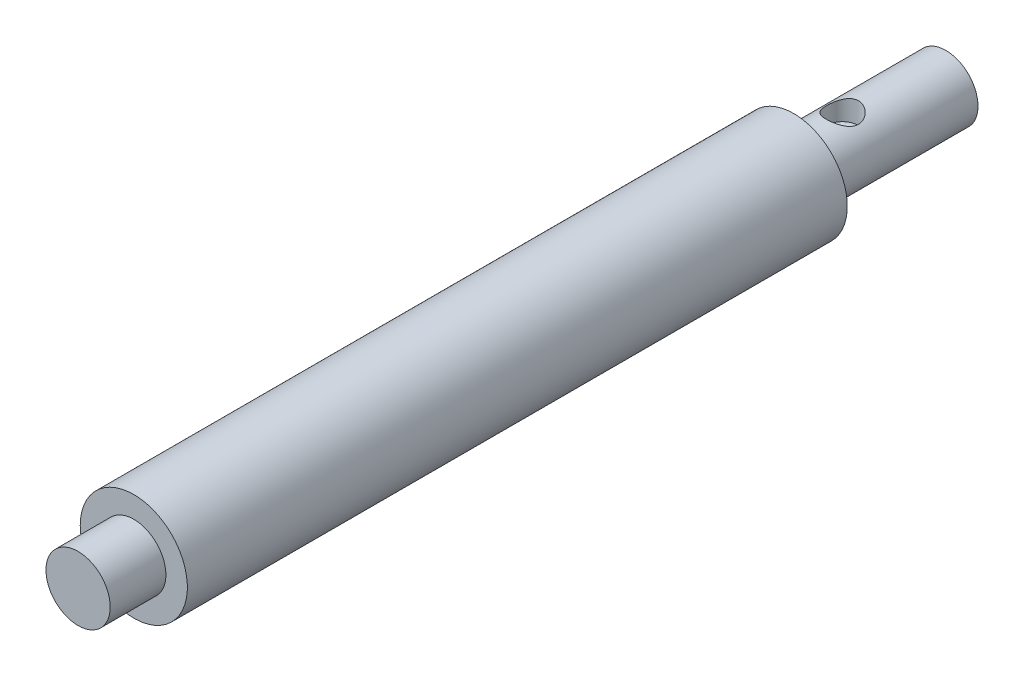
ISO-10303-21;
HEADER;
FILE_DESCRIPTION(('STEP AP214'),'2;1');
FILE_NAME('part.step','',(''),(''),'','','');
FILE_SCHEMA(('AUTOMOTIVE_DESIGN { 1 0 10303 214 1 1 1 1 }'));
ENDSEC;
DATA;
#1=APPLICATION_CONTEXT('core data for automotive mechanical design processes');
#2=APPLICATION_PROTOCOL_DEFINITION('international standard','automotive_design',2000,#1);
#3=PRODUCT_CONTEXT('',#1,'mechanical');
#4=PRODUCT('Part','Part','',(#3));
#5=PRODUCT_RELATED_PRODUCT_CATEGORY('part','',(#4));
#6=PRODUCT_DEFINITION_FORMATION('','',#4);
#7=PRODUCT_DEFINITION_CONTEXT('part definition',#1,'design');
#8=PRODUCT_DEFINITION('design','',#6,#7);
#9=PRODUCT_DEFINITION_SHAPE('','',#8);
#10=(LENGTH_UNIT() NAMED_UNIT(*) SI_UNIT(.MILLI.,.METRE.));
#11=(NAMED_UNIT(*) PLANE_ANGLE_UNIT() SI_UNIT($,.RADIAN.));
#12=(NAMED_UNIT(*) SI_UNIT($,.STERADIAN.) SOLID_ANGLE_UNIT());
#13=UNCERTAINTY_MEASURE_WITH_UNIT(LENGTH_MEASURE(1.E-05),#10,'distance_accuracy_value','');
#14=(GEOMETRIC_REPRESENTATION_CONTEXT(3) GLOBAL_UNCERTAINTY_ASSIGNED_CONTEXT((#13)) GLOBAL_UNIT_ASSIGNED_CONTEXT((#10,
#11,#12)) REPRESENTATION_CONTEXT('',''));
#15=CARTESIAN_POINT('',(0.,0.,0.));
#16=DIRECTION('',(0.,0.,1.));
#17=DIRECTION('',(1.,0.,0.));
#18=AXIS2_PLACEMENT_3D('',#15,#16,#17);
#19=CARTESIAN_POINT('',(0.,0.,0.));
#20=DIRECTION('',(0.,0.,1.));
#21=DIRECTION('',(1.,0.,0.));
#22=AXIS2_PLACEMENT_3D('',#19,#20,#21);
#23=PLANE('',#22);
#24=CARTESIAN_POINT('',(0.,0.,0.));
#25=DIRECTION('',(0.,0.,1.));
#26=DIRECTION('',(1.,0.,0.));
#27=AXIS2_PLACEMENT_3D('',#24,#25,#26);
#28=CIRCLE('',#27,5.);
#29=CARTESIAN_POINT('',(-5.,0.,0.));
#30=VERTEX_POINT('',#29);
#31=EDGE_CURVE('E49',#30,#30,#28,.T.);
#32=ORIENTED_EDGE('',*,*,#31,.F.);
#33=EDGE_LOOP('',(#32));
#34=FACE_BOUND('',#33,.T.);
#35=CARTESIAN_POINT('',(0.,0.,0.));
#36=DIRECTION('',(0.,0.,1.));
#37=DIRECTION('',(1.,0.,0.));
#38=AXIS2_PLACEMENT_3D('',#35,#36,#37);
#39=CIRCLE('',#38,3.);
#40=CARTESIAN_POINT('',(3.,0.,0.));
#41=VERTEX_POINT('',#40);
#42=EDGE_CURVE('E41',#41,#41,#39,.F.);
#43=ORIENTED_EDGE('',*,*,#42,.F.);
#44=EDGE_LOOP('',(#43));
#45=FACE_BOUND('',#44,.T.);
#46=ADVANCED_FACE('F30',(#34,#45),#23,.F.);
#47=CARTESIAN_POINT('',(0.,0.,61.6));
#48=DIRECTION('',(0.,0.,1.));
#49=DIRECTION('',(1.,0.,0.));
#50=AXIS2_PLACEMENT_3D('',#47,#48,#49);
#51=PLANE('',#50);
#52=CARTESIAN_POINT('',(0.,0.,61.6));
#53=DIRECTION('',(0.,0.,1.));
#54=DIRECTION('',(1.,0.,0.));
#55=AXIS2_PLACEMENT_3D('',#52,#53,#54);
#56=CIRCLE('',#55,5.);
#57=CARTESIAN_POINT('',(-5.,0.,61.6));
#58=VERTEX_POINT('',#57);
#59=EDGE_CURVE('E45',#58,#58,#56,.T.);
#60=ORIENTED_EDGE('',*,*,#59,.T.);
#61=EDGE_LOOP('',(#60));
#62=FACE_BOUND('',#61,.T.);
#63=CARTESIAN_POINT('',(0.,0.,61.6));
#64=DIRECTION('',(0.,0.,1.));
#65=DIRECTION('',(1.,0.,0.));
#66=AXIS2_PLACEMENT_3D('',#63,#64,#65);
#67=CIRCLE('',#66,3.);
#68=CARTESIAN_POINT('',(3.,0.,61.6));
#69=VERTEX_POINT('',#68);
#70=EDGE_CURVE('E55',#69,#69,#67,.T.);
#71=ORIENTED_EDGE('',*,*,#70,.F.);
#72=EDGE_LOOP('',(#71));
#73=FACE_BOUND('',#72,.T.);
#74=ADVANCED_FACE('F83',(#62,#73),#51,.T.);
#75=CARTESIAN_POINT('',(0.,0.,61.6));
#76=DIRECTION('',(0.,0.,-1.));
#77=DIRECTION('',(-1.,0.,0.));
#78=AXIS2_PLACEMENT_3D('',#75,#76,#77);
#79=CYLINDRICAL_SURFACE('',#78,5.);
#80=CARTESIAN_POINT('',(-5.,0.,61.6));
#81=CARTESIAN_POINT('',(-5.,0.,60.9583333333333));
#82=CARTESIAN_POINT('',(-5.,0.,60.3166666666667));
#83=CARTESIAN_POINT('',(-5.,0.,59.0333333333333));
#84=CARTESIAN_POINT('',(-5.,0.,58.3916666666667));
#85=CARTESIAN_POINT('',(-5.,0.,57.1083333333333));
#86=CARTESIAN_POINT('',(-5.,0.,56.4666666666667));
#87=CARTESIAN_POINT('',(-5.,0.,55.1833333333333));
#88=CARTESIAN_POINT('',(-5.,0.,54.5416666666667));
#89=CARTESIAN_POINT('',(-5.,0.,53.2583333333333));
#90=CARTESIAN_POINT('',(-5.,0.,52.6166666666667));
#91=CARTESIAN_POINT('',(-5.,0.,51.3333333333333));
#92=CARTESIAN_POINT('',(-5.,0.,50.6916666666667));
#93=CARTESIAN_POINT('',(-5.,0.,49.4083333333333));
#94=CARTESIAN_POINT('',(-5.,0.,48.7666666666667));
#95=CARTESIAN_POINT('',(-5.,0.,47.4833333333333));
#96=CARTESIAN_POINT('',(-5.,0.,46.8416666666667));
#97=CARTESIAN_POINT('',(-5.,0.,45.5583333333333));
#98=CARTESIAN_POINT('',(-5.,0.,44.9166666666667));
#99=CARTESIAN_POINT('',(-5.,0.,43.6333333333333));
#100=CARTESIAN_POINT('',(-5.,0.,42.9916666666667));
#101=CARTESIAN_POINT('',(-5.,0.,41.7083333333333));
#102=CARTESIAN_POINT('',(-5.,0.,41.0666666666667));
#103=CARTESIAN_POINT('',(-5.,0.,39.7833333333333));
#104=CARTESIAN_POINT('',(-5.,0.,39.1416666666667));
#105=CARTESIAN_POINT('',(-5.,0.,37.8583333333333));
#106=CARTESIAN_POINT('',(-5.,0.,37.2166666666667));
#107=CARTESIAN_POINT('',(-5.,0.,35.9333333333333));
#108=CARTESIAN_POINT('',(-5.,0.,35.2916666666667));
#109=CARTESIAN_POINT('',(-5.,0.,34.0083333333333));
#110=CARTESIAN_POINT('',(-5.,0.,33.3666666666667));
#111=CARTESIAN_POINT('',(-5.,0.,32.0833333333333));
#112=CARTESIAN_POINT('',(-5.,0.,31.4416666666667));
#113=CARTESIAN_POINT('',(-5.,0.,30.1583333333333));
#114=CARTESIAN_POINT('',(-5.,0.,29.5166666666667));
#115=CARTESIAN_POINT('',(-5.,0.,28.2333333333333));
#116=CARTESIAN_POINT('',(-5.,0.,27.5916666666667));
#117=CARTESIAN_POINT('',(-5.,0.,26.3083333333333));
#118=CARTESIAN_POINT('',(-5.,0.,25.6666666666667));
#119=CARTESIAN_POINT('',(-5.,0.,24.3833333333333));
#120=CARTESIAN_POINT('',(-5.,0.,23.7416666666667));
#121=CARTESIAN_POINT('',(-5.,0.,22.4583333333333));
#122=CARTESIAN_POINT('',(-5.,0.,21.8166666666667));
#123=CARTESIAN_POINT('',(-5.,0.,20.5333333333333));
#124=CARTESIAN_POINT('',(-5.,0.,19.8916666666667));
#125=CARTESIAN_POINT('',(-5.,0.,18.6083333333333));
#126=CARTESIAN_POINT('',(-5.,0.,17.9666666666667));
#127=CARTESIAN_POINT('',(-5.,0.,16.6833333333333));
#128=CARTESIAN_POINT('',(-5.,0.,16.0416666666667));
#129=CARTESIAN_POINT('',(-5.,0.,14.7583333333333));
#130=CARTESIAN_POINT('',(-5.,0.,14.1166666666667));
#131=CARTESIAN_POINT('',(-5.,0.,12.8333333333333));
#132=CARTESIAN_POINT('',(-5.,0.,12.1916666666667));
#133=CARTESIAN_POINT('',(-5.,0.,10.9083333333333));
#134=CARTESIAN_POINT('',(-5.,0.,10.2666666666667));
#135=CARTESIAN_POINT('',(-5.,0.,8.98333333333333));
#136=CARTESIAN_POINT('',(-5.,0.,8.34166666666666));
#137=CARTESIAN_POINT('',(-5.,0.,7.05833333333333));
#138=CARTESIAN_POINT('',(-5.,0.,6.41666666666666));
#139=CARTESIAN_POINT('',(-5.,0.,5.13333333333333));
#140=CARTESIAN_POINT('',(-5.,0.,4.49166666666666));
#141=CARTESIAN_POINT('',(-5.,0.,3.20833333333333));
#142=CARTESIAN_POINT('',(-5.,0.,2.56666666666666));
#143=CARTESIAN_POINT('',(-5.,0.,1.28333333333333));
#144=CARTESIAN_POINT('',(-5.,0.,0.64166666666666));
#145=CARTESIAN_POINT('',(-5.,0.,0.));
#146=B_SPLINE_CURVE_WITH_KNOTS('',3,(#80,#81,#82,#83,#84,#85,#86,#87,#88,#89,#90,#91,#92,#93,
#94,#95,#96,#97,#98,#99,#100,#101,#102,#103,#104,#105,#106,#107,#108,#109,#110,#111,#112,#113,
#114,#115,#116,#117,#118,#119,#120,#121,#122,#123,#124,#125,#126,#127,#128,#129,#130,#131,#132,
#133,#134,#135,#136,#137,#138,#139,#140,#141,#142,#143,#144,#145),.UNSPECIFIED.,.F.,.F.,(4,2,2,
2,2,2,2,2,2,2,2,2,2,2,2,2,2,2,2,2,2,2,2,2,2,2,2,2,2,2,2,2,4),(0.,1.925,3.85,5.775,7.7,
9.62499999999999,11.55,13.475,15.4,17.325,19.25,21.175,23.1,25.025,26.95,28.875,30.8,32.725,
34.65,36.575,38.5,40.425,42.35,44.275,46.2,48.125,50.05,51.975,53.9,55.825,57.75,59.675,61.6),.UNSPECIFIED.);
#147=EDGE_CURVE('BSEAM32',#58,#30,#146,.T.);
#148=ORIENTED_EDGE('',*,*,#59,.F.);
#149=ORIENTED_EDGE('',*,*,#31,.T.);
#150=ORIENTED_EDGE('',*,*,#147,.T.);
#151=ORIENTED_EDGE('',*,*,#147,.F.);
#152=EDGE_LOOP('',(#148,#150,#149,#151));
#153=FACE_BOUND('',#152,.T.);
#154=ADVANCED_FACE('F32',(#153),#79,.T.);
#155=CARTESIAN_POINT('',(0.,0.,66.8));
#156=DIRECTION('',(0.,0.,-1.));
#157=DIRECTION('',(-1.,0.,0.));
#158=AXIS2_PLACEMENT_3D('',#155,#156,#157);
#159=CYLINDRICAL_SURFACE('',#158,3.);
#160=CARTESIAN_POINT('',(0.,0.,66.8));
#161=DIRECTION('',(0.,0.,1.));
#162=DIRECTION('',(1.,0.,0.));
#163=AXIS2_PLACEMENT_3D('',#160,#161,#162);
#164=CIRCLE('',#163,3.);
#165=CARTESIAN_POINT('',(3.,0.,66.8));
#166=VERTEX_POINT('',#165);
#167=EDGE_CURVE('E53',#166,#166,#164,.T.);
#168=ORIENTED_EDGE('',*,*,#167,.F.);
#169=EDGE_LOOP('',(#168));
#170=FACE_BOUND('',#169,.T.);
#171=ORIENTED_EDGE('',*,*,#70,.T.);
#172=EDGE_LOOP('',(#171));
#173=FACE_BOUND('',#172,.T.);
#174=ADVANCED_FACE('F93',(#170,#173),#159,.T.);
#175=CARTESIAN_POINT('',(0.,0.,66.8));
#176=DIRECTION('',(0.,0.,1.));
#177=DIRECTION('',(1.,0.,0.));
#178=AXIS2_PLACEMENT_3D('',#175,#176,#177);
#179=PLANE('',#178);
#180=ORIENTED_EDGE('',*,*,#167,.T.);
#181=EDGE_LOOP('',(#180));
#182=FACE_BOUND('',#181,.T.);
#183=ADVANCED_FACE('F96',(#182),#179,.T.);
#184=CARTESIAN_POINT('',(0.,0.,-14.2));
#185=DIRECTION('',(0.,0.,1.));
#186=DIRECTION('',(1.,0.,0.));
#187=AXIS2_PLACEMENT_3D('',#184,#185,#186);
#188=CYLINDRICAL_SURFACE('',#187,3.);
#189=CARTESIAN_POINT('',(0.,3.,-3.05));
#190=CARTESIAN_POINT('',(-0.0788579444268502,2.99999570107562,-3.05000495347579));
#191=CARTESIAN_POINT('',(-0.157809899546344,2.99685736529635,-3.05625510968158));
#192=CARTESIAN_POINT('',(-0.313380352903344,2.98461234055736,-3.08097932051231));
#193=CARTESIAN_POINT('',(-0.389994130070444,2.97549431743379,-3.09947658949672));
#194=CARTESIAN_POINT('',(-0.538400317320674,2.95224419105063,-3.14779071292494));
#195=CARTESIAN_POINT('',(-0.610210204408719,2.93813158766306,-3.17756357637195));
#196=CARTESIAN_POINT('',(-0.747708925209898,2.90618664773642,-3.24735593204748));
#197=CARTESIAN_POINT('',(-0.813398240985089,2.88835460450288,-3.2873746163733));
#198=CARTESIAN_POINT('',(-0.941261726642864,2.84934387387093,-3.37927587422793));
#199=CARTESIAN_POINT('',(-1.00298281668316,2.82802798691306,-3.43172971885946));
#200=CARTESIAN_POINT('',(-1.11716916730047,2.78489955370114,-3.54578221887056));
#201=CARTESIAN_POINT('',(-1.16962737466015,2.76308664313552,-3.60738777765866));
#202=CARTESIAN_POINT('',(-1.26787800067542,2.71948426796021,-3.74372502428507));
#203=CARTESIAN_POINT('',(-1.31283800332746,2.69782780455198,-3.81910414751887));
#204=CARTESIAN_POINT('',(-1.38925234033604,2.65928968158481,-3.97755100397932));
#205=CARTESIAN_POINT('',(-1.4207163224495,2.64240461410484,-4.06061319308413));
#206=CARTESIAN_POINT('',(-1.46719866328288,2.61686800556713,-4.22699765813288));
#207=CARTESIAN_POINT('',(-1.48308878562066,2.6077840737557,-4.31000667810109));
#208=CARTESIAN_POINT('',(-1.50064048996327,2.59772834922792,-4.47796825666922));
#209=CARTESIAN_POINT('',(-1.50231613255961,2.59674854014932,-4.56291881130673));
#210=CARTESIAN_POINT('',(-1.49203093075844,2.60266395385873,-4.72142903647305));
#211=CARTESIAN_POINT('',(-1.48167683930523,2.6086314549302,-4.79513604683458));
#212=CARTESIAN_POINT('',(-1.4504097735854,2.62614343100775,-4.93958286405956));
#213=CARTESIAN_POINT('',(-1.42949343584648,2.63768968247664,-5.01032171795798));
#214=CARTESIAN_POINT('',(-1.37731467057901,2.66531214619112,-5.14884369884849));
#215=CARTESIAN_POINT('',(-1.34582260067399,2.68148760995998,-5.21651959817868));
#216=CARTESIAN_POINT('',(-1.273562531502,2.71655106422106,-5.34595143888501));
#217=CARTESIAN_POINT('',(-1.2327903657187,2.73544027170286,-5.40770470340013));
#218=CARTESIAN_POINT('',(-1.13709908236918,2.77669736854929,-5.53178187911484));
#219=CARTESIAN_POINT('',(-1.08104168755392,2.79920265355119,-5.59318531036424));
#220=CARTESIAN_POINT('',(-0.95933336811206,2.84321434950611,-5.70610312788635));
#221=CARTESIAN_POINT('',(-0.893677884861428,2.86472027938201,-5.75761278805082));
#222=CARTESIAN_POINT('',(-0.750774758747773,2.90552980924446,-5.85152849154459));
#223=CARTESIAN_POINT('',(-0.673130387399113,2.92468476243011,-5.89340070866861));
#224=CARTESIAN_POINT('',(-0.510699323233195,2.95736821681863,-5.96314554356451));
#225=CARTESIAN_POINT('',(-0.425918364397914,2.9709011841533,-5.99102927752275));
#226=CARTESIAN_POINT('',(-0.259149737491053,2.98986500612153,-6.02971310557502));
#227=CARTESIAN_POINT('',(-0.177512295822489,2.99587407451965,-6.04173685362017));
#228=CARTESIAN_POINT('',(-0.0131693999240271,3.00109520188655,-6.05219709670173));
#229=CARTESIAN_POINT('',(0.0695355298048635,3.00031048081978,-6.0506400284592));
#230=CARTESIAN_POINT('',(0.226849457978981,2.99236788380152,-6.03468996737188));
#231=CARTESIAN_POINT('',(0.301589112074896,2.98570868532252,-6.02130120090501));
#232=CARTESIAN_POINT('',(0.447610338452912,2.9673325697226,-5.98364289215732));
#233=CARTESIAN_POINT('',(0.518891528536631,2.95561509501618,-5.95937215031976));
#234=CARTESIAN_POINT('',(0.658332912674359,2.92776377120382,-5.90000230035045));
#235=CARTESIAN_POINT('',(0.726345595508705,2.91151322654446,-5.86461342482557));
#236=CARTESIAN_POINT('',(0.855692042548907,2.87615961476126,-5.78433869653015));
#237=CARTESIAN_POINT('',(0.917022944664887,2.85705533350407,-5.73944879810691));
#238=CARTESIAN_POINT('',(1.03765153393382,2.81562332004297,-5.63635936200393));
#239=CARTESIAN_POINT('',(1.09615811672854,2.79316327265249,-5.57728569733228));
#240=CARTESIAN_POINT('',(1.20278448167828,2.7489358741323,-5.45011227308341));
#241=CARTESIAN_POINT('',(1.25089707856781,2.72716901100071,-5.38200632172812));
#242=CARTESIAN_POINT('',(1.33756187171853,2.68576788309734,-5.23453451874054));
#243=CARTESIAN_POINT('',(1.37553824370037,2.66628794383591,-5.15478310085828));
#244=CARTESIAN_POINT('',(1.43712423890206,2.63361108441202,-4.98873489863755));
#245=CARTESIAN_POINT('',(1.46075237380052,2.62040607332625,-4.90244671029966));
#246=CARTESIAN_POINT('',(1.49079253120031,2.60342251538703,-4.73463466567294));
#247=CARTESIAN_POINT('',(1.49863949460818,2.59886075197597,-4.65344861984714));
#248=CARTESIAN_POINT('',(1.5010337315643,2.59748031962405,-4.49082939925321));
#249=CARTESIAN_POINT('',(1.49558676993486,2.60065829439585,-4.40939634689321));
#250=CARTESIAN_POINT('',(1.47288918838996,2.61356793076615,-4.25677474769984));
#251=CARTESIAN_POINT('',(1.45681247151455,2.62264641723988,-4.18534929478289));
#252=CARTESIAN_POINT('',(1.41476303733662,2.64556524281479,-4.04628782086345));
#253=CARTESIAN_POINT('',(1.38878713673988,2.65940711354503,-3.97865302686195));
#254=CARTESIAN_POINT('',(1.32572361795085,2.69142795546804,-3.84406272352019));
#255=CARTESIAN_POINT('',(1.28800670672355,2.70983583593881,-3.77745814725646));
#256=CARTESIAN_POINT('',(1.20322645745609,2.74852997452291,-3.65108819572811));
#257=CARTESIAN_POINT('',(1.15615825686234,2.76881720693416,-3.59132640421833));
#258=CARTESIAN_POINT('',(1.04730498999206,2.81193484737138,-3.47278702646799));
#259=CARTESIAN_POINT('',(0.984426634495891,2.83477474959942,-3.41501134647456));
#260=CARTESIAN_POINT('',(0.849232209349795,2.87816628389896,-3.3106055248471));
#261=CARTESIAN_POINT('',(0.776911084957795,2.89871667939293,-3.26398139079514));
#262=CARTESIAN_POINT('',(0.623897395174417,2.93547014349806,-3.18314545593189));
#263=CARTESIAN_POINT('',(0.543149255665095,2.95164144740899,-3.1490237461453));
#264=CARTESIAN_POINT('',(0.376113151707129,2.9775201194848,-3.09528774836389));
#265=CARTESIAN_POINT('',(0.289841699383649,2.98724585044602,-3.07563222979143));
#266=CARTESIAN_POINT('',(0.168902919736342,2.99543192870217,-3.05915388337139));
#267=CARTESIAN_POINT('',(0.135242819162346,2.99714048010376,-3.05572603870049));
#268=CARTESIAN_POINT('',(0.067727597707637,2.99942545465223,-3.05114800172887));
#269=CARTESIAN_POINT('',(0.0338724714699425,3.00000184655071,-3.04999787229469));
#270=CARTESIAN_POINT('',(0.,3.,-3.05));
#271=B_SPLINE_CURVE_WITH_KNOTS('',3,(#189,#190,#191,#192,#193,#194,#195,#196,#197,#198,#199,
#200,#201,#202,#203,#204,#205,#206,#207,#208,#209,#210,#211,#212,#213,#214,#215,#216,#217,#218,
#219,#220,#221,#222,#223,#224,#225,#226,#227,#228,#229,#230,#231,#232,#233,#234,#235,#236,#237,
#238,#239,#240,#241,#242,#243,#244,#245,#246,#247,#248,#249,#250,#251,#252,#253,#254,#255,#256,
#257,#258,#259,#260,#261,#262,#263,#264,#265,#266,#267,#268,#269,#270),.UNSPECIFIED.,.T.,.F.,(4,
2,2,2,2,2,2,2,2,2,2,2,2,2,2,2,2,2,2,2,2,2,2,2,2,2,2,2,2,2,2,2,2,2,2,2,2,2,2,2,4),(0.,
0.236436386130439,0.473322224563797,0.709293233238447,0.945245640872352,1.19547263807713,
1.44588935648105,1.71572589646129,1.98536921847422,2.23887018210344,2.49212035993531,
2.71508568613981,2.93812205888518,3.16635360252731,3.39468781890333,3.65197412000818,
3.9093830189803,4.17874533321661,4.44789325368419,4.69474935707018,4.94148846767214,
5.16910359759183,5.39674382446397,5.63089284041848,5.86514176122509,6.12239415966628,
6.37982382923148,6.64972023242589,6.91926767918176,7.1629396125457,7.40650589797017,
7.62686895373283,7.84730293182526,8.08254685170431,8.31791341715446,8.58187864135757,
8.84598575071868,9.1119602049529,9.37717362931724,9.47872920200875,9.58028757766599),.UNSPECIFIED.);
#272=CARTESIAN_POINT('',(0.,3.,-3.05));
#273=VERTEX_POINT('',#272);
#274=EDGE_CURVE('E10',#273,#273,#271,.T.);
#275=ORIENTED_EDGE('',*,*,#274,.T.);
#276=EDGE_LOOP('',(#275));
#277=FACE_BOUND('',#276,.T.);
#278=CARTESIAN_POINT('',(0.,0.,-14.2));
#279=DIRECTION('',(0.,0.,-1.));
#280=DIRECTION('',(-1.,0.,0.));
#281=AXIS2_PLACEMENT_3D('',#278,#279,#280);
#282=CIRCLE('',#281,3.);
#283=CARTESIAN_POINT('',(-3.,0.,-14.2));
#284=VERTEX_POINT('',#283);
#285=EDGE_CURVE('E58',#284,#284,#282,.T.);
#286=ORIENTED_EDGE('',*,*,#285,.F.);
#287=EDGE_LOOP('',(#286));
#288=FACE_BOUND('',#287,.T.);
#289=ORIENTED_EDGE('',*,*,#42,.T.);
#290=EDGE_LOOP('',(#289));
#291=FACE_BOUND('',#290,.T.);
#292=ADVANCED_FACE('F78',(#277,#288,#291),#188,.T.);
#293=CARTESIAN_POINT('',(0.,0.,-14.2));
#294=DIRECTION('',(0.,0.,-1.));
#295=DIRECTION('',(-1.,0.,0.));
#296=AXIS2_PLACEMENT_3D('',#293,#294,#295);
#297=PLANE('',#296);
#298=ORIENTED_EDGE('',*,*,#285,.T.);
#299=EDGE_LOOP('',(#298));
#300=FACE_BOUND('',#299,.T.);
#301=ADVANCED_FACE('F72',(#300),#297,.T.);
#302=CARTESIAN_POINT('',(0.,1.,-4.55));
#303=DIRECTION('',(0.,1.,0.));
#304=DIRECTION('',(0.,0.,1.));
#305=AXIS2_PLACEMENT_3D('',#302,#303,#304);
#306=CYLINDRICAL_SURFACE('',#305,1.5);
#307=CARTESIAN_POINT('',(0.,1.,-4.55));
#308=DIRECTION('',(0.,1.,0.));
#309=DIRECTION('',(0.,0.,1.));
#310=AXIS2_PLACEMENT_3D('',#307,#308,#309);
#311=CIRCLE('',#310,1.5);
#312=CARTESIAN_POINT('',(0.,1.,-3.05));
#313=VERTEX_POINT('',#312);
#314=EDGE_CURVE('E63',#313,#313,#311,.T.);
#315=ORIENTED_EDGE('',*,*,#314,.F.);
#316=EDGE_LOOP('',(#315));
#317=FACE_BOUND('',#316,.T.);
#318=ORIENTED_EDGE('',*,*,#274,.F.);
#319=EDGE_LOOP('',(#318));
#320=FACE_BOUND('',#319,.T.);
#321=ADVANCED_FACE('F69',(#317,#320),#306,.F.);
#322=CARTESIAN_POINT('',(0.,1.,-4.55));
#323=DIRECTION('',(0.,1.,0.));
#324=DIRECTION('',(0.,0.,1.));
#325=AXIS2_PLACEMENT_3D('',#322,#323,#324);
#326=PLANE('',#325);
#327=ORIENTED_EDGE('',*,*,#314,.T.);
#328=EDGE_LOOP('',(#327));
#329=FACE_BOUND('',#328,.T.);
#330=ADVANCED_FACE('F67',(#329),#326,.T.);
#331=CLOSED_SHELL('',(#46,#74,#154,#174,#183,#292,#301,#321,#330));
#332=MANIFOLD_SOLID_BREP('B2',#331);
#333=ADVANCED_BREP_SHAPE_REPRESENTATION('',(#18,#332),#14);
#334=SHAPE_DEFINITION_REPRESENTATION(#9,#333);
ENDSEC;
END-ISO-10303-21;
